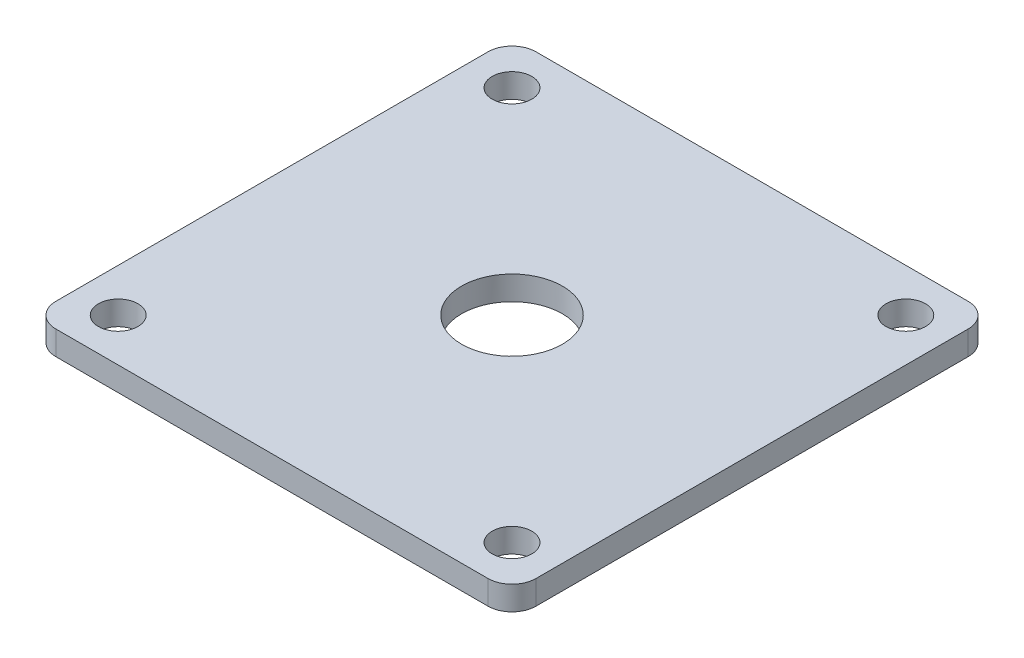
ISO-10303-21;
HEADER;
FILE_DESCRIPTION(('STEP AP214'),'2;1');
FILE_NAME('part.step','',(''),(''),'','','');
FILE_SCHEMA(('AUTOMOTIVE_DESIGN { 1 0 10303 214 1 1 1 1 }'));
ENDSEC;
DATA;
#1=APPLICATION_CONTEXT('core data for automotive mechanical design processes');
#2=APPLICATION_PROTOCOL_DEFINITION('international standard','automotive_design',2000,#1);
#3=PRODUCT_CONTEXT('',#1,'mechanical');
#4=PRODUCT('Part','Part','',(#3));
#5=PRODUCT_RELATED_PRODUCT_CATEGORY('part','',(#4));
#6=PRODUCT_DEFINITION_FORMATION('','',#4);
#7=PRODUCT_DEFINITION_CONTEXT('part definition',#1,'design');
#8=PRODUCT_DEFINITION('design','',#6,#7);
#9=PRODUCT_DEFINITION_SHAPE('','',#8);
#10=(LENGTH_UNIT() NAMED_UNIT(*) SI_UNIT(.MILLI.,.METRE.));
#11=(NAMED_UNIT(*) PLANE_ANGLE_UNIT() SI_UNIT($,.RADIAN.));
#12=(NAMED_UNIT(*) SI_UNIT($,.STERADIAN.) SOLID_ANGLE_UNIT());
#13=UNCERTAINTY_MEASURE_WITH_UNIT(LENGTH_MEASURE(1.E-05),#10,'distance_accuracy_value','');
#14=(GEOMETRIC_REPRESENTATION_CONTEXT(3) GLOBAL_UNCERTAINTY_ASSIGNED_CONTEXT((#13)) GLOBAL_UNIT_ASSIGNED_CONTEXT((#10,
#11,#12)) REPRESENTATION_CONTEXT('',''));
#15=CARTESIAN_POINT('',(0.,0.,0.));
#16=DIRECTION('',(0.,0.,1.));
#17=DIRECTION('',(1.,0.,0.));
#18=AXIS2_PLACEMENT_3D('',#15,#16,#17);
#19=CARTESIAN_POINT('',(31.75,3.175,31.75));
#20=DIRECTION('',(-1.,0.,0.));
#21=DIRECTION('',(0.,0.,1.));
#22=AXIS2_PLACEMENT_3D('',#19,#20,#21);
#23=PLANE('',#22);
#24=DIRECTION('',(0.,0.,-1.));
#25=VECTOR('',#24,1.);
#26=CARTESIAN_POINT('',(31.75,0.,31.75));
#27=LINE('',#26,#25);
#28=CARTESIAN_POINT('',(31.75,0.,28.575));
#29=VERTEX_POINT('',#28);
#30=CARTESIAN_POINT('',(31.75,0.,-28.575));
#31=VERTEX_POINT('',#30);
#32=EDGE_CURVE('E130',#29,#31,#27,.T.);
#33=ORIENTED_EDGE('',*,*,#32,.T.);
#34=DIRECTION('',(0.,-1.,0.));
#35=VECTOR('',#34,1.);
#36=CARTESIAN_POINT('',(31.75,3.175,-28.575));
#37=LINE('',#36,#35);
#38=CARTESIAN_POINT('',(31.75,3.175,-28.575));
#39=VERTEX_POINT('',#38);
#40=EDGE_CURVE('E108',#31,#39,#37,.F.);
#41=ORIENTED_EDGE('',*,*,#40,.T.);
#42=DIRECTION('',(0.,0.,-1.));
#43=VECTOR('',#42,1.);
#44=CARTESIAN_POINT('',(31.75,3.175,31.75));
#45=LINE('',#44,#43);
#46=CARTESIAN_POINT('',(31.75,3.175,28.575));
#47=VERTEX_POINT('',#46);
#48=EDGE_CURVE('E140',#47,#39,#45,.T.);
#49=ORIENTED_EDGE('',*,*,#48,.F.);
#50=DIRECTION('',(0.,-1.,0.));
#51=VECTOR('',#50,1.);
#52=CARTESIAN_POINT('',(31.75,3.175,28.575));
#53=LINE('',#52,#51);
#54=EDGE_CURVE('E113',#47,#29,#53,.T.);
#55=ORIENTED_EDGE('',*,*,#54,.T.);
#56=EDGE_LOOP('',(#33,#41,#49,#55));
#57=FACE_BOUND('',#56,.T.);
#58=ADVANCED_FACE('F37',(#57),#23,.F.);
#59=CARTESIAN_POINT('',(-31.75,3.175,-31.75));
#60=DIRECTION('',(0.,0.,1.));
#61=DIRECTION('',(1.,0.,0.));
#62=AXIS2_PLACEMENT_3D('',#59,#60,#61);
#63=PLANE('',#62);
#64=DIRECTION('',(-1.,0.,0.));
#65=VECTOR('',#64,1.);
#66=CARTESIAN_POINT('',(-31.75,3.175,-31.75));
#67=LINE('',#66,#65);
#68=CARTESIAN_POINT('',(28.575,3.175,-31.75));
#69=VERTEX_POINT('',#68);
#70=CARTESIAN_POINT('',(-28.575,3.175,-31.75));
#71=VERTEX_POINT('',#70);
#72=EDGE_CURVE('E123',#69,#71,#67,.T.);
#73=ORIENTED_EDGE('',*,*,#72,.F.);
#74=DIRECTION('',(0.,-1.,0.));
#75=VECTOR('',#74,1.);
#76=CARTESIAN_POINT('',(28.575,3.175,-31.75));
#77=LINE('',#76,#75);
#78=CARTESIAN_POINT('',(28.575,0.,-31.75));
#79=VERTEX_POINT('',#78);
#80=EDGE_CURVE('E107',#69,#79,#77,.T.);
#81=ORIENTED_EDGE('',*,*,#80,.T.);
#82=DIRECTION('',(-1.,0.,0.));
#83=VECTOR('',#82,1.);
#84=CARTESIAN_POINT('',(-31.75,0.,-31.75));
#85=LINE('',#84,#83);
#86=CARTESIAN_POINT('',(-28.575,0.,-31.75));
#87=VERTEX_POINT('',#86);
#88=EDGE_CURVE('E120',#79,#87,#85,.T.);
#89=ORIENTED_EDGE('',*,*,#88,.T.);
#90=DIRECTION('',(0.,-1.,0.));
#91=VECTOR('',#90,1.);
#92=CARTESIAN_POINT('',(-28.575,3.175,-31.75));
#93=LINE('',#92,#91);
#94=EDGE_CURVE('E125',#87,#71,#93,.F.);
#95=ORIENTED_EDGE('',*,*,#94,.T.);
#96=EDGE_LOOP('',(#73,#81,#89,#95));
#97=FACE_BOUND('',#96,.T.);
#98=ADVANCED_FACE('F119',(#97),#63,.F.);
#99=CARTESIAN_POINT('',(-31.75,3.175,31.75));
#100=DIRECTION('',(1.,0.,0.));
#101=DIRECTION('',(0.,0.,-1.));
#102=AXIS2_PLACEMENT_3D('',#99,#100,#101);
#103=PLANE('',#102);
#104=DIRECTION('',(0.,0.,1.));
#105=VECTOR('',#104,1.);
#106=CARTESIAN_POINT('',(-31.75,3.175,31.75));
#107=LINE('',#106,#105);
#108=CARTESIAN_POINT('',(-31.75,3.175,-28.575));
#109=VERTEX_POINT('',#108);
#110=CARTESIAN_POINT('',(-31.75,3.175,28.575));
#111=VERTEX_POINT('',#110);
#112=EDGE_CURVE('E166',#109,#111,#107,.T.);
#113=ORIENTED_EDGE('',*,*,#112,.F.);
#114=DIRECTION('',(0.,-1.,0.));
#115=VECTOR('',#114,1.);
#116=CARTESIAN_POINT('',(-31.75,3.175,-28.575));
#117=LINE('',#116,#115);
#118=CARTESIAN_POINT('',(-31.75,0.,-28.575));
#119=VERTEX_POINT('',#118);
#120=EDGE_CURVE('E159',#109,#119,#117,.T.);
#121=ORIENTED_EDGE('',*,*,#120,.T.);
#122=DIRECTION('',(0.,0.,1.));
#123=VECTOR('',#122,1.);
#124=CARTESIAN_POINT('',(-31.75,0.,31.75));
#125=LINE('',#124,#123);
#126=CARTESIAN_POINT('',(-31.75,0.,28.575));
#127=VERTEX_POINT('',#126);
#128=EDGE_CURVE('E129',#119,#127,#125,.T.);
#129=ORIENTED_EDGE('',*,*,#128,.T.);
#130=DIRECTION('',(0.,-1.,0.));
#131=VECTOR('',#130,1.);
#132=CARTESIAN_POINT('',(-31.75,3.175,28.575));
#133=LINE('',#132,#131);
#134=EDGE_CURVE('E157',#127,#111,#133,.F.);
#135=ORIENTED_EDGE('',*,*,#134,.T.);
#136=EDGE_LOOP('',(#113,#121,#129,#135));
#137=FACE_BOUND('',#136,.T.);
#138=ADVANCED_FACE('F164',(#137),#103,.F.);
#139=CARTESIAN_POINT('',(-31.75,3.175,31.75));
#140=DIRECTION('',(0.,0.,-1.));
#141=DIRECTION('',(-1.,0.,0.));
#142=AXIS2_PLACEMENT_3D('',#139,#140,#141);
#143=PLANE('',#142);
#144=DIRECTION('',(1.,0.,0.));
#145=VECTOR('',#144,1.);
#146=CARTESIAN_POINT('',(-31.75,3.175,31.75));
#147=LINE('',#146,#145);
#148=CARTESIAN_POINT('',(-28.575,3.175,31.75));
#149=VERTEX_POINT('',#148);
#150=CARTESIAN_POINT('',(28.575,3.175,31.75));
#151=VERTEX_POINT('',#150);
#152=EDGE_CURVE('E141',#149,#151,#147,.T.);
#153=ORIENTED_EDGE('',*,*,#152,.F.);
#154=DIRECTION('',(0.,-1.,0.));
#155=VECTOR('',#154,1.);
#156=CARTESIAN_POINT('',(-28.575,3.175,31.75));
#157=LINE('',#156,#155);
#158=CARTESIAN_POINT('',(-28.575,0.,31.75));
#159=VERTEX_POINT('',#158);
#160=EDGE_CURVE('E11',#149,#159,#157,.T.);
#161=ORIENTED_EDGE('',*,*,#160,.T.);
#162=DIRECTION('',(1.,0.,0.));
#163=VECTOR('',#162,1.);
#164=CARTESIAN_POINT('',(-31.75,0.,31.75));
#165=LINE('',#164,#163);
#166=CARTESIAN_POINT('',(28.575,0.,31.75));
#167=VERTEX_POINT('',#166);
#168=EDGE_CURVE('E133',#159,#167,#165,.T.);
#169=ORIENTED_EDGE('',*,*,#168,.T.);
#170=DIRECTION('',(0.,-1.,0.));
#171=VECTOR('',#170,1.);
#172=CARTESIAN_POINT('',(28.575,3.175,31.75));
#173=LINE('',#172,#171);
#174=EDGE_CURVE('E45',#167,#151,#173,.F.);
#175=ORIENTED_EDGE('',*,*,#174,.T.);
#176=EDGE_LOOP('',(#153,#161,#169,#175));
#177=FACE_BOUND('',#176,.T.);
#178=ADVANCED_FACE('F173',(#177),#143,.F.);
#179=CARTESIAN_POINT('',(0.,3.175,0.));
#180=DIRECTION('',(0.,-1.,0.));
#181=DIRECTION('',(0.,0.,-1.));
#182=AXIS2_PLACEMENT_3D('',#179,#180,#181);
#183=PLANE('',#182);
#184=CARTESIAN_POINT('',(-26.0427427511008,3.175,26.0427427511005));
#185=DIRECTION('',(0.,1.,0.));
#186=DIRECTION('',(0.,0.,1.));
#187=AXIS2_PLACEMENT_3D('',#184,#185,#186);
#188=CIRCLE('',#187,2.6162);
#189=CARTESIAN_POINT('',(-26.0427427511008,3.175,28.6589427511005));
#190=VERTEX_POINT('',#189);
#191=EDGE_CURVE('E191',#190,#190,#188,.T.);
#192=ORIENTED_EDGE('',*,*,#191,.F.);
#193=EDGE_LOOP('',(#192));
#194=FACE_BOUND('',#193,.T.);
#195=CARTESIAN_POINT('',(26.0427427511004,3.175,-26.0427427511007));
#196=DIRECTION('',(0.,1.,0.));
#197=DIRECTION('',(0.,0.,-1.));
#198=AXIS2_PLACEMENT_3D('',#195,#196,#197);
#199=CIRCLE('',#198,2.6162);
#200=CARTESIAN_POINT('',(26.0427427511004,3.175,-28.6589427511007));
#201=VERTEX_POINT('',#200);
#202=EDGE_CURVE('E197',#201,#201,#199,.T.);
#203=ORIENTED_EDGE('',*,*,#202,.F.);
#204=EDGE_LOOP('',(#203));
#205=FACE_BOUND('',#204,.T.);
#206=CARTESIAN_POINT('',(-26.0427427511008,3.175,-26.0427427511005));
#207=DIRECTION('',(0.,1.,0.));
#208=DIRECTION('',(0.,0.,-1.));
#209=AXIS2_PLACEMENT_3D('',#206,#207,#208);
#210=CIRCLE('',#209,2.6162);
#211=CARTESIAN_POINT('',(-26.0427427511008,3.175,-28.6589427511005));
#212=VERTEX_POINT('',#211);
#213=EDGE_CURVE('E198',#212,#212,#210,.T.);
#214=ORIENTED_EDGE('',*,*,#213,.F.);
#215=EDGE_LOOP('',(#214));
#216=FACE_BOUND('',#215,.T.);
#217=CARTESIAN_POINT('',(26.0427427511004,3.175,26.0427427511007));
#218=DIRECTION('',(0.,1.,0.));
#219=DIRECTION('',(0.,0.,1.));
#220=AXIS2_PLACEMENT_3D('',#217,#218,#219);
#221=CIRCLE('',#220,2.6162);
#222=CARTESIAN_POINT('',(26.0427427511004,3.175,28.6589427511007));
#223=VERTEX_POINT('',#222);
#224=EDGE_CURVE('E184',#223,#223,#221,.T.);
#225=ORIENTED_EDGE('',*,*,#224,.F.);
#226=EDGE_LOOP('',(#225));
#227=FACE_BOUND('',#226,.T.);
#228=CARTESIAN_POINT('',(0.,3.175,0.));
#229=DIRECTION('',(0.,1.,0.));
#230=DIRECTION('',(0.,0.,1.));
#231=AXIS2_PLACEMENT_3D('',#228,#229,#230);
#232=CIRCLE('',#231,6.6675);
#233=CARTESIAN_POINT('',(0.,3.175,6.6675));
#234=VERTEX_POINT('',#233);
#235=EDGE_CURVE('E135',#234,#234,#232,.T.);
#236=ORIENTED_EDGE('',*,*,#235,.F.);
#237=EDGE_LOOP('',(#236));
#238=FACE_BOUND('',#237,.T.);
#239=ORIENTED_EDGE('',*,*,#48,.T.);
#240=CARTESIAN_POINT('',(28.575,3.175,-28.575));
#241=DIRECTION('',(0.,-1.,0.));
#242=DIRECTION('',(0.,0.,-1.));
#243=AXIS2_PLACEMENT_3D('',#240,#241,#242);
#244=CIRCLE('',#243,3.175);
#245=EDGE_CURVE('E155',#39,#69,#244,.F.);
#246=ORIENTED_EDGE('',*,*,#245,.T.);
#247=ORIENTED_EDGE('',*,*,#72,.T.);
#248=CARTESIAN_POINT('',(-28.575,3.175,-28.575));
#249=DIRECTION('',(0.,-1.,0.));
#250=DIRECTION('',(0.,0.,-1.));
#251=AXIS2_PLACEMENT_3D('',#248,#249,#250);
#252=CIRCLE('',#251,3.175);
#253=EDGE_CURVE('E153',#71,#109,#252,.F.);
#254=ORIENTED_EDGE('',*,*,#253,.T.);
#255=ORIENTED_EDGE('',*,*,#112,.T.);
#256=CARTESIAN_POINT('',(-28.575,3.175,28.575));
#257=DIRECTION('',(0.,-1.,0.));
#258=DIRECTION('',(0.,0.,-1.));
#259=AXIS2_PLACEMENT_3D('',#256,#257,#258);
#260=CIRCLE('',#259,3.175);
#261=EDGE_CURVE('E58',#111,#149,#260,.F.);
#262=ORIENTED_EDGE('',*,*,#261,.T.);
#263=ORIENTED_EDGE('',*,*,#152,.T.);
#264=CARTESIAN_POINT('',(28.575,3.175,28.575));
#265=DIRECTION('',(0.,-1.,0.));
#266=DIRECTION('',(0.,0.,-1.));
#267=AXIS2_PLACEMENT_3D('',#264,#265,#266);
#268=CIRCLE('',#267,3.175);
#269=EDGE_CURVE('E150',#151,#47,#268,.F.);
#270=ORIENTED_EDGE('',*,*,#269,.T.);
#271=EDGE_LOOP('',(#239,#246,#247,#254,#255,#262,#263,#270));
#272=FACE_BOUND('',#271,.T.);
#273=ADVANCED_FACE('F214',(#194,#205,#216,#227,#238,#272),#183,.F.);
#274=CARTESIAN_POINT('',(0.,0.,0.));
#275=DIRECTION('',(0.,-1.,0.));
#276=DIRECTION('',(0.,0.,-1.));
#277=AXIS2_PLACEMENT_3D('',#274,#275,#276);
#278=PLANE('',#277);
#279=CARTESIAN_POINT('',(-26.0427427511008,0.,26.0427427511005));
#280=DIRECTION('',(0.,-1.,0.));
#281=DIRECTION('',(0.,0.,-1.));
#282=AXIS2_PLACEMENT_3D('',#279,#280,#281);
#283=CIRCLE('',#282,2.6162);
#284=CARTESIAN_POINT('',(-26.0427427511008,0.,23.4265427511005));
#285=VERTEX_POINT('',#284);
#286=EDGE_CURVE('E201',#285,#285,#283,.F.);
#287=ORIENTED_EDGE('',*,*,#286,.T.);
#288=EDGE_LOOP('',(#287));
#289=FACE_BOUND('',#288,.T.);
#290=CARTESIAN_POINT('',(26.0427427511004,0.,-26.0427427511007));
#291=DIRECTION('',(0.,-1.,0.));
#292=DIRECTION('',(0.,0.,-1.));
#293=AXIS2_PLACEMENT_3D('',#290,#291,#292);
#294=CIRCLE('',#293,2.6162);
#295=CARTESIAN_POINT('',(26.0427427511004,0.,-28.6589427511007));
#296=VERTEX_POINT('',#295);
#297=EDGE_CURVE('E194',#296,#296,#294,.F.);
#298=ORIENTED_EDGE('',*,*,#297,.T.);
#299=EDGE_LOOP('',(#298));
#300=FACE_BOUND('',#299,.T.);
#301=CARTESIAN_POINT('',(-26.0427427511008,0.,-26.0427427511005));
#302=DIRECTION('',(0.,-1.,0.));
#303=DIRECTION('',(0.,0.,-1.));
#304=AXIS2_PLACEMENT_3D('',#301,#302,#303);
#305=CIRCLE('',#304,2.6162);
#306=CARTESIAN_POINT('',(-26.0427427511008,0.,-28.6589427511005));
#307=VERTEX_POINT('',#306);
#308=EDGE_CURVE('E206',#307,#307,#305,.F.);
#309=ORIENTED_EDGE('',*,*,#308,.T.);
#310=EDGE_LOOP('',(#309));
#311=FACE_BOUND('',#310,.T.);
#312=CARTESIAN_POINT('',(26.0427427511004,0.,26.0427427511007));
#313=DIRECTION('',(0.,-1.,0.));
#314=DIRECTION('',(0.,0.,-1.));
#315=AXIS2_PLACEMENT_3D('',#312,#313,#314);
#316=CIRCLE('',#315,2.6162);
#317=CARTESIAN_POINT('',(26.0427427511004,0.,23.4265427511007));
#318=VERTEX_POINT('',#317);
#319=EDGE_CURVE('E188',#318,#318,#316,.F.);
#320=ORIENTED_EDGE('',*,*,#319,.T.);
#321=EDGE_LOOP('',(#320));
#322=FACE_BOUND('',#321,.T.);
#323=CARTESIAN_POINT('',(0.,0.,0.));
#324=DIRECTION('',(0.,-1.,0.));
#325=DIRECTION('',(0.,0.,-1.));
#326=AXIS2_PLACEMENT_3D('',#323,#324,#325);
#327=CIRCLE('',#326,6.6675);
#328=CARTESIAN_POINT('',(0.,0.,-6.6675));
#329=VERTEX_POINT('',#328);
#330=EDGE_CURVE('E180',#329,#329,#327,.F.);
#331=ORIENTED_EDGE('',*,*,#330,.T.);
#332=EDGE_LOOP('',(#331));
#333=FACE_BOUND('',#332,.T.);
#334=ORIENTED_EDGE('',*,*,#88,.F.);
#335=CARTESIAN_POINT('',(28.575,0.,-28.575));
#336=DIRECTION('',(0.,-1.,0.));
#337=DIRECTION('',(0.,0.,-1.));
#338=AXIS2_PLACEMENT_3D('',#335,#336,#337);
#339=CIRCLE('',#338,3.175);
#340=EDGE_CURVE('E103',#79,#31,#339,.T.);
#341=ORIENTED_EDGE('',*,*,#340,.T.);
#342=ORIENTED_EDGE('',*,*,#32,.F.);
#343=CARTESIAN_POINT('',(28.575,0.,28.575));
#344=DIRECTION('',(0.,-1.,0.));
#345=DIRECTION('',(0.,0.,-1.));
#346=AXIS2_PLACEMENT_3D('',#343,#344,#345);
#347=CIRCLE('',#346,3.175);
#348=EDGE_CURVE('E124',#29,#167,#347,.T.);
#349=ORIENTED_EDGE('',*,*,#348,.T.);
#350=ORIENTED_EDGE('',*,*,#168,.F.);
#351=CARTESIAN_POINT('',(-28.575,0.,28.575));
#352=DIRECTION('',(0.,-1.,0.));
#353=DIRECTION('',(0.,0.,-1.));
#354=AXIS2_PLACEMENT_3D('',#351,#352,#353);
#355=CIRCLE('',#354,3.175);
#356=EDGE_CURVE('E144',#159,#127,#355,.T.);
#357=ORIENTED_EDGE('',*,*,#356,.T.);
#358=ORIENTED_EDGE('',*,*,#128,.F.);
#359=CARTESIAN_POINT('',(-28.575,0.,-28.575));
#360=DIRECTION('',(0.,-1.,0.));
#361=DIRECTION('',(0.,0.,-1.));
#362=AXIS2_PLACEMENT_3D('',#359,#360,#361);
#363=CIRCLE('',#362,3.175);
#364=EDGE_CURVE('E114',#119,#87,#363,.T.);
#365=ORIENTED_EDGE('',*,*,#364,.T.);
#366=EDGE_LOOP('',(#334,#341,#342,#349,#350,#357,#358,#365));
#367=FACE_BOUND('',#366,.T.);
#368=ADVANCED_FACE('F127',(#289,#300,#311,#322,#333,#367),#278,.T.);
#369=CARTESIAN_POINT('',(28.575,3.175,-28.575));
#370=DIRECTION('',(0.,-1.,0.));
#371=DIRECTION('',(0.,0.,-1.));
#372=AXIS2_PLACEMENT_3D('',#369,#370,#371);
#373=CYLINDRICAL_SURFACE('',#372,3.175);
#374=ORIENTED_EDGE('',*,*,#245,.F.);
#375=ORIENTED_EDGE('',*,*,#40,.F.);
#376=ORIENTED_EDGE('',*,*,#340,.F.);
#377=ORIENTED_EDGE('',*,*,#80,.F.);
#378=EDGE_LOOP('',(#374,#375,#376,#377));
#379=FACE_BOUND('',#378,.T.);
#380=ADVANCED_FACE('F106',(#379),#373,.T.);
#381=CARTESIAN_POINT('',(-28.575,3.175,-28.575));
#382=DIRECTION('',(0.,-1.,0.));
#383=DIRECTION('',(0.,0.,-1.));
#384=AXIS2_PLACEMENT_3D('',#381,#382,#383);
#385=CYLINDRICAL_SURFACE('',#384,3.175);
#386=ORIENTED_EDGE('',*,*,#253,.F.);
#387=ORIENTED_EDGE('',*,*,#94,.F.);
#388=ORIENTED_EDGE('',*,*,#364,.F.);
#389=ORIENTED_EDGE('',*,*,#120,.F.);
#390=EDGE_LOOP('',(#386,#387,#388,#389));
#391=FACE_BOUND('',#390,.T.);
#392=ADVANCED_FACE('F235',(#391),#385,.T.);
#393=CARTESIAN_POINT('',(-28.575,3.175,28.575));
#394=DIRECTION('',(0.,-1.,0.));
#395=DIRECTION('',(0.,0.,-1.));
#396=AXIS2_PLACEMENT_3D('',#393,#394,#395);
#397=CYLINDRICAL_SURFACE('',#396,3.175);
#398=ORIENTED_EDGE('',*,*,#261,.F.);
#399=ORIENTED_EDGE('',*,*,#134,.F.);
#400=ORIENTED_EDGE('',*,*,#356,.F.);
#401=ORIENTED_EDGE('',*,*,#160,.F.);
#402=EDGE_LOOP('',(#398,#399,#400,#401));
#403=FACE_BOUND('',#402,.T.);
#404=ADVANCED_FACE('F172',(#403),#397,.T.);
#405=CARTESIAN_POINT('',(28.575,3.175,28.575));
#406=DIRECTION('',(0.,-1.,0.));
#407=DIRECTION('',(0.,0.,-1.));
#408=AXIS2_PLACEMENT_3D('',#405,#406,#407);
#409=CYLINDRICAL_SURFACE('',#408,3.175);
#410=ORIENTED_EDGE('',*,*,#269,.F.);
#411=ORIENTED_EDGE('',*,*,#174,.F.);
#412=ORIENTED_EDGE('',*,*,#348,.F.);
#413=ORIENTED_EDGE('',*,*,#54,.F.);
#414=EDGE_LOOP('',(#410,#411,#412,#413));
#415=FACE_BOUND('',#414,.T.);
#416=ADVANCED_FACE('F39',(#415),#409,.T.);
#417=CARTESIAN_POINT('',(0.,-0.00100000000000013,0.));
#418=DIRECTION('',(0.,1.,0.));
#419=DIRECTION('',(0.,0.,1.));
#420=AXIS2_PLACEMENT_3D('',#417,#418,#419);
#421=CYLINDRICAL_SURFACE('',#420,6.6675);
#422=ORIENTED_EDGE('',*,*,#330,.F.);
#423=EDGE_LOOP('',(#422));
#424=FACE_BOUND('',#423,.T.);
#425=ORIENTED_EDGE('',*,*,#235,.T.);
#426=EDGE_LOOP('',(#425));
#427=FACE_BOUND('',#426,.T.);
#428=ADVANCED_FACE('F227',(#424,#427),#421,.F.);
#429=CARTESIAN_POINT('',(26.0427427511004,-0.00100000000000013,26.0427427511007));
#430=DIRECTION('',(0.,1.,0.));
#431=DIRECTION('',(0.,0.,1.));
#432=AXIS2_PLACEMENT_3D('',#429,#430,#431);
#433=CYLINDRICAL_SURFACE('',#432,2.6162);
#434=ORIENTED_EDGE('',*,*,#319,.F.);
#435=EDGE_LOOP('',(#434));
#436=FACE_BOUND('',#435,.T.);
#437=ORIENTED_EDGE('',*,*,#224,.T.);
#438=EDGE_LOOP('',(#437));
#439=FACE_BOUND('',#438,.T.);
#440=ADVANCED_FACE('F232',(#436,#439),#433,.F.);
#441=CARTESIAN_POINT('',(-26.0427427511008,-0.00100000000000013,-26.0427427511005));
#442=DIRECTION('',(0.,1.,0.));
#443=DIRECTION('',(0.,0.,1.));
#444=AXIS2_PLACEMENT_3D('',#441,#442,#443);
#445=CYLINDRICAL_SURFACE('',#444,2.6162);
#446=ORIENTED_EDGE('',*,*,#308,.F.);
#447=EDGE_LOOP('',(#446));
#448=FACE_BOUND('',#447,.T.);
#449=ORIENTED_EDGE('',*,*,#213,.T.);
#450=EDGE_LOOP('',(#449));
#451=FACE_BOUND('',#450,.T.);
#452=ADVANCED_FACE('F212',(#448,#451),#445,.F.);
#453=CARTESIAN_POINT('',(26.0427427511004,-0.00100000000000013,-26.0427427511007));
#454=DIRECTION('',(0.,1.,0.));
#455=DIRECTION('',(0.,0.,1.));
#456=AXIS2_PLACEMENT_3D('',#453,#454,#455);
#457=CYLINDRICAL_SURFACE('',#456,2.6162);
#458=ORIENTED_EDGE('',*,*,#297,.F.);
#459=EDGE_LOOP('',(#458));
#460=FACE_BOUND('',#459,.T.);
#461=ORIENTED_EDGE('',*,*,#202,.T.);
#462=EDGE_LOOP('',(#461));
#463=FACE_BOUND('',#462,.T.);
#464=ADVANCED_FACE('F300',(#460,#463),#457,.F.);
#465=CARTESIAN_POINT('',(-26.0427427511008,-0.00100000000000013,26.0427427511005));
#466=DIRECTION('',(0.,1.,0.));
#467=DIRECTION('',(0.,0.,1.));
#468=AXIS2_PLACEMENT_3D('',#465,#466,#467);
#469=CYLINDRICAL_SURFACE('',#468,2.6162);
#470=ORIENTED_EDGE('',*,*,#286,.F.);
#471=EDGE_LOOP('',(#470));
#472=FACE_BOUND('',#471,.T.);
#473=ORIENTED_EDGE('',*,*,#191,.T.);
#474=EDGE_LOOP('',(#473));
#475=FACE_BOUND('',#474,.T.);
#476=ADVANCED_FACE('F310',(#472,#475),#469,.F.);
#477=CLOSED_SHELL('',(#58,#98,#138,#178,#273,#368,#380,#392,#404,#416,#428,#440,#452,#464,#476));
#478=MANIFOLD_SOLID_BREP('B2',#477);
#479=ADVANCED_BREP_SHAPE_REPRESENTATION('',(#18,#478),#14);
#480=SHAPE_DEFINITION_REPRESENTATION(#9,#479);
ENDSEC;
END-ISO-10303-21;
